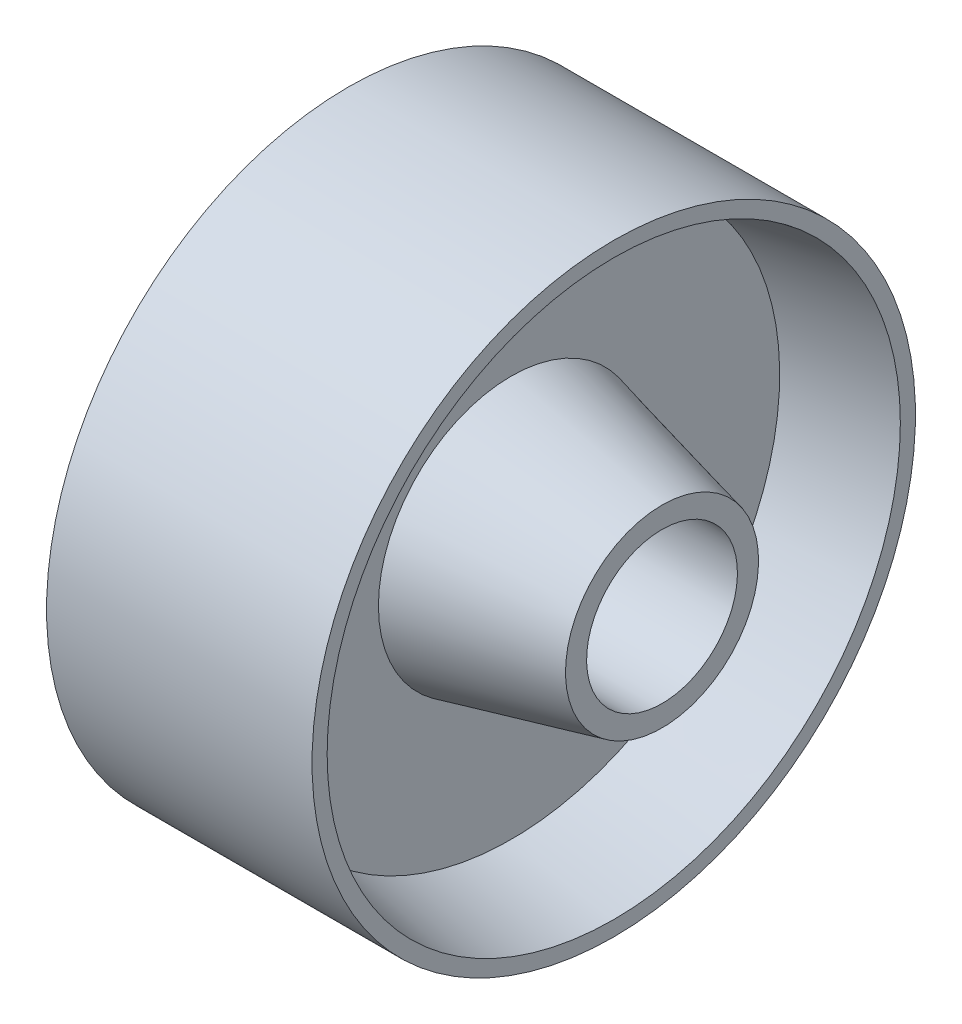
ISO-10303-21;
HEADER;
FILE_DESCRIPTION(('STEP AP214'),'2;1');
FILE_NAME('part.step','',(''),(''),'','','');
FILE_SCHEMA(('AUTOMOTIVE_DESIGN { 1 0 10303 214 1 1 1 1 }'));
ENDSEC;
DATA;
#1=APPLICATION_CONTEXT('core data for automotive mechanical design processes');
#2=APPLICATION_PROTOCOL_DEFINITION('international standard','automotive_design',2000,#1);
#3=PRODUCT_CONTEXT('',#1,'mechanical');
#4=PRODUCT('Part','Part','',(#3));
#5=PRODUCT_RELATED_PRODUCT_CATEGORY('part','',(#4));
#6=PRODUCT_DEFINITION_FORMATION('','',#4);
#7=PRODUCT_DEFINITION_CONTEXT('part definition',#1,'design');
#8=PRODUCT_DEFINITION('design','',#6,#7);
#9=PRODUCT_DEFINITION_SHAPE('','',#8);
#10=(LENGTH_UNIT() NAMED_UNIT(*) SI_UNIT(.MILLI.,.METRE.));
#11=(NAMED_UNIT(*) PLANE_ANGLE_UNIT() SI_UNIT($,.RADIAN.));
#12=(NAMED_UNIT(*) SI_UNIT($,.STERADIAN.) SOLID_ANGLE_UNIT());
#13=UNCERTAINTY_MEASURE_WITH_UNIT(LENGTH_MEASURE(1.E-05),#10,'distance_accuracy_value','');
#14=(GEOMETRIC_REPRESENTATION_CONTEXT(3) GLOBAL_UNCERTAINTY_ASSIGNED_CONTEXT((#13)) GLOBAL_UNIT_ASSIGNED_CONTEXT((#10,
#11,#12)) REPRESENTATION_CONTEXT('',''));
#15=CARTESIAN_POINT('',(0.,0.,0.));
#16=DIRECTION('',(0.,0.,1.));
#17=DIRECTION('',(1.,0.,0.));
#18=AXIS2_PLACEMENT_3D('',#15,#16,#17);
#19=CARTESIAN_POINT('',(-22.,-34.8636363636364,0.));
#20=DIRECTION('',(-1.,0.,0.));
#21=DIRECTION('',(0.,-1.,0.));
#22=AXIS2_PLACEMENT_3D('',#19,#20,#21);
#23=CONICAL_SURFACE('',#22,47.5,0.17467219900824);
#24=CARTESIAN_POINT('',(-4.99999999999999,-34.8636363636364,0.));
#25=DIRECTION('',(1.,0.,0.));
#26=DIRECTION('',(0.,1.,0.));
#27=AXIS2_PLACEMENT_3D('',#24,#25,#26);
#28=CIRCLE('',#27,44.5);
#29=CARTESIAN_POINT('',(-5.,9.63636363636364,0.));
#30=VERTEX_POINT('',#29);
#31=EDGE_CURVE('E84',#30,#30,#28,.T.);
#32=ORIENTED_EDGE('',*,*,#31,.T.);
#33=EDGE_LOOP('',(#32));
#34=FACE_BOUND('',#33,.T.);
#35=CARTESIAN_POINT('',(-22.,-34.8636363636364,0.));
#36=DIRECTION('',(1.,0.,0.));
#37=DIRECTION('',(0.,1.,0.));
#38=AXIS2_PLACEMENT_3D('',#35,#36,#37);
#39=CIRCLE('',#38,47.5);
#40=CARTESIAN_POINT('',(-22.,12.6363636363636,0.));
#41=VERTEX_POINT('',#40);
#42=EDGE_CURVE('E12',#41,#41,#39,.T.);
#43=ORIENTED_EDGE('',*,*,#42,.F.);
#44=EDGE_LOOP('',(#43));
#45=FACE_BOUND('',#44,.T.);
#46=ADVANCED_FACE('F44',(#34,#45),#23,.F.);
#47=CARTESIAN_POINT('',(-22.,12.6363636363636,0.));
#48=DIRECTION('',(-1.,0.,0.));
#49=DIRECTION('',(0.,-1.,0.));
#50=AXIS2_PLACEMENT_3D('',#47,#48,#49);
#51=PLANE('',#50);
#52=ORIENTED_EDGE('',*,*,#42,.T.);
#53=EDGE_LOOP('',(#52));
#54=FACE_BOUND('',#53,.T.);
#55=CARTESIAN_POINT('',(-22.,-34.8636363636364,0.));
#56=DIRECTION('',(1.,0.,0.));
#57=DIRECTION('',(0.,1.,0.));
#58=AXIS2_PLACEMENT_3D('',#55,#56,#57);
#59=CIRCLE('',#58,50.);
#60=CARTESIAN_POINT('',(-22.,15.1363636363636,0.));
#61=VERTEX_POINT('',#60);
#62=EDGE_CURVE('E50',#61,#61,#59,.T.);
#63=ORIENTED_EDGE('',*,*,#62,.F.);
#64=EDGE_LOOP('',(#63));
#65=FACE_BOUND('',#64,.T.);
#66=ADVANCED_FACE('F102',(#54,#65),#51,.T.);
#67=CARTESIAN_POINT('',(0.,-34.8636363636364,0.));
#68=DIRECTION('',(1.,0.,0.));
#69=DIRECTION('',(0.,1.,0.));
#70=AXIS2_PLACEMENT_3D('',#67,#68,#69);
#71=CYLINDRICAL_SURFACE('',#70,50.);
#72=ORIENTED_EDGE('',*,*,#62,.T.);
#73=EDGE_LOOP('',(#72));
#74=FACE_BOUND('',#73,.T.);
#75=CARTESIAN_POINT('',(22.,-34.8636363636364,0.));
#76=DIRECTION('',(1.,0.,0.));
#77=DIRECTION('',(0.,1.,0.));
#78=AXIS2_PLACEMENT_3D('',#75,#76,#77);
#79=CIRCLE('',#78,50.);
#80=CARTESIAN_POINT('',(22.,15.1363636363636,0.));
#81=VERTEX_POINT('',#80);
#82=EDGE_CURVE('E54',#81,#81,#79,.T.);
#83=ORIENTED_EDGE('',*,*,#82,.F.);
#84=EDGE_LOOP('',(#83));
#85=FACE_BOUND('',#84,.T.);
#86=ADVANCED_FACE('F106',(#74,#85),#71,.T.);
#87=CARTESIAN_POINT('',(22.,12.6363636363636,0.));
#88=DIRECTION('',(1.,0.,0.));
#89=DIRECTION('',(0.,1.,0.));
#90=AXIS2_PLACEMENT_3D('',#87,#88,#89);
#91=PLANE('',#90);
#92=ORIENTED_EDGE('',*,*,#82,.T.);
#93=EDGE_LOOP('',(#92));
#94=FACE_BOUND('',#93,.T.);
#95=CARTESIAN_POINT('',(22.,-34.8636363636364,0.));
#96=DIRECTION('',(1.,0.,0.));
#97=DIRECTION('',(0.,1.,0.));
#98=AXIS2_PLACEMENT_3D('',#95,#96,#97);
#99=CIRCLE('',#98,47.5);
#100=CARTESIAN_POINT('',(22.,12.6363636363636,0.));
#101=VERTEX_POINT('',#100);
#102=EDGE_CURVE('E58',#101,#101,#99,.T.);
#103=ORIENTED_EDGE('',*,*,#102,.F.);
#104=EDGE_LOOP('',(#103));
#105=FACE_BOUND('',#104,.T.);
#106=ADVANCED_FACE('F110',(#94,#105),#91,.T.);
#107=CARTESIAN_POINT('',(5.,-34.8636363636364,0.));
#108=DIRECTION('',(1.,0.,0.));
#109=DIRECTION('',(0.,1.,0.));
#110=AXIS2_PLACEMENT_3D('',#107,#108,#109);
#111=CONICAL_SURFACE('',#110,44.5,0.17467219900824);
#112=ORIENTED_EDGE('',*,*,#102,.T.);
#113=EDGE_LOOP('',(#112));
#114=FACE_BOUND('',#113,.T.);
#115=CARTESIAN_POINT('',(5.,-34.8636363636364,0.));
#116=DIRECTION('',(1.,0.,0.));
#117=DIRECTION('',(0.,1.,0.));
#118=AXIS2_PLACEMENT_3D('',#115,#116,#117);
#119=CIRCLE('',#118,44.5);
#120=CARTESIAN_POINT('',(5.,9.63636363636364,0.));
#121=VERTEX_POINT('',#120);
#122=EDGE_CURVE('E63',#121,#121,#119,.T.);
#123=ORIENTED_EDGE('',*,*,#122,.F.);
#124=EDGE_LOOP('',(#123));
#125=FACE_BOUND('',#124,.T.);
#126=ADVANCED_FACE('F116',(#114,#125),#111,.F.);
#127=CARTESIAN_POINT('',(5.,9.63636363636364,0.));
#128=DIRECTION('',(1.,0.,0.));
#129=DIRECTION('',(0.,1.,0.));
#130=AXIS2_PLACEMENT_3D('',#127,#128,#129);
#131=PLANE('',#130);
#132=ORIENTED_EDGE('',*,*,#122,.T.);
#133=EDGE_LOOP('',(#132));
#134=FACE_BOUND('',#133,.T.);
#135=CARTESIAN_POINT('',(5.,-34.8636363636364,0.));
#136=DIRECTION('',(1.,0.,0.));
#137=DIRECTION('',(0.,1.,0.));
#138=AXIS2_PLACEMENT_3D('',#135,#136,#137);
#139=CIRCLE('',#138,22.);
#140=CARTESIAN_POINT('',(4.99999999999999,-12.8636363636364,0.));
#141=VERTEX_POINT('',#140);
#142=EDGE_CURVE('E66',#141,#141,#139,.T.);
#143=ORIENTED_EDGE('',*,*,#142,.F.);
#144=EDGE_LOOP('',(#143));
#145=FACE_BOUND('',#144,.T.);
#146=ADVANCED_FACE('F120',(#134,#145),#131,.T.);
#147=CARTESIAN_POINT('',(30.,-34.8636363636363,0.));
#148=DIRECTION('',(-1.,0.,0.));
#149=DIRECTION('',(0.,-1.,0.));
#150=AXIS2_PLACEMENT_3D('',#147,#148,#149);
#151=CONICAL_SURFACE('',#150,16.,0.235544980720864);
#152=ORIENTED_EDGE('',*,*,#142,.T.);
#153=EDGE_LOOP('',(#152));
#154=FACE_BOUND('',#153,.T.);
#155=CARTESIAN_POINT('',(30.,-34.8636363636363,0.));
#156=DIRECTION('',(1.,0.,0.));
#157=DIRECTION('',(0.,1.,0.));
#158=AXIS2_PLACEMENT_3D('',#155,#156,#157);
#159=CIRCLE('',#158,16.);
#160=CARTESIAN_POINT('',(30.,-18.8636363636364,0.));
#161=VERTEX_POINT('',#160);
#162=EDGE_CURVE('E69',#161,#161,#159,.T.);
#163=ORIENTED_EDGE('',*,*,#162,.F.);
#164=EDGE_LOOP('',(#163));
#165=FACE_BOUND('',#164,.T.);
#166=ADVANCED_FACE('F124',(#154,#165),#151,.T.);
#167=CARTESIAN_POINT('',(30.,-18.8636363636364,0.));
#168=DIRECTION('',(1.,0.,0.));
#169=DIRECTION('',(0.,1.,0.));
#170=AXIS2_PLACEMENT_3D('',#167,#168,#169);
#171=PLANE('',#170);
#172=ORIENTED_EDGE('',*,*,#162,.T.);
#173=EDGE_LOOP('',(#172));
#174=FACE_BOUND('',#173,.T.);
#175=CARTESIAN_POINT('',(30.,-34.8636363636363,0.));
#176=DIRECTION('',(1.,0.,0.));
#177=DIRECTION('',(0.,1.,0.));
#178=AXIS2_PLACEMENT_3D('',#175,#176,#177);
#179=CIRCLE('',#178,12.5);
#180=CARTESIAN_POINT('',(30.,-22.3636363636364,0.));
#181=VERTEX_POINT('',#180);
#182=EDGE_CURVE('E72',#181,#181,#179,.T.);
#183=ORIENTED_EDGE('',*,*,#182,.F.);
#184=EDGE_LOOP('',(#183));
#185=FACE_BOUND('',#184,.T.);
#186=ADVANCED_FACE('F128',(#174,#185),#171,.T.);
#187=CARTESIAN_POINT('',(0.,-34.8636363636364,0.));
#188=DIRECTION('',(1.,0.,0.));
#189=DIRECTION('',(0.,1.,0.));
#190=AXIS2_PLACEMENT_3D('',#187,#188,#189);
#191=CYLINDRICAL_SURFACE('',#190,12.5);
#192=ORIENTED_EDGE('',*,*,#182,.T.);
#193=EDGE_LOOP('',(#192));
#194=FACE_BOUND('',#193,.T.);
#195=CARTESIAN_POINT('',(-30.,-34.8636363636364,0.));
#196=DIRECTION('',(1.,0.,0.));
#197=DIRECTION('',(0.,1.,0.));
#198=AXIS2_PLACEMENT_3D('',#195,#196,#197);
#199=CIRCLE('',#198,12.5);
#200=CARTESIAN_POINT('',(-30.,-22.3636363636364,0.));
#201=VERTEX_POINT('',#200);
#202=EDGE_CURVE('E75',#201,#201,#199,.T.);
#203=ORIENTED_EDGE('',*,*,#202,.F.);
#204=EDGE_LOOP('',(#203));
#205=FACE_BOUND('',#204,.T.);
#206=ADVANCED_FACE('F132',(#194,#205),#191,.F.);
#207=CARTESIAN_POINT('',(-30.,-18.8636363636364,0.));
#208=DIRECTION('',(-1.,0.,0.));
#209=DIRECTION('',(0.,-1.,0.));
#210=AXIS2_PLACEMENT_3D('',#207,#208,#209);
#211=PLANE('',#210);
#212=ORIENTED_EDGE('',*,*,#202,.T.);
#213=EDGE_LOOP('',(#212));
#214=FACE_BOUND('',#213,.T.);
#215=CARTESIAN_POINT('',(-30.,-34.8636363636364,0.));
#216=DIRECTION('',(1.,0.,0.));
#217=DIRECTION('',(0.,1.,0.));
#218=AXIS2_PLACEMENT_3D('',#215,#216,#217);
#219=CIRCLE('',#218,16.);
#220=CARTESIAN_POINT('',(-30.,-18.8636363636364,0.));
#221=VERTEX_POINT('',#220);
#222=EDGE_CURVE('E78',#221,#221,#219,.T.);
#223=ORIENTED_EDGE('',*,*,#222,.F.);
#224=EDGE_LOOP('',(#223));
#225=FACE_BOUND('',#224,.T.);
#226=ADVANCED_FACE('F98',(#214,#225),#211,.T.);
#227=CARTESIAN_POINT('',(-4.99999999999999,-34.8636363636364,0.));
#228=DIRECTION('',(1.,0.,0.));
#229=DIRECTION('',(0.,1.,0.));
#230=AXIS2_PLACEMENT_3D('',#227,#228,#229);
#231=CONICAL_SURFACE('',#230,22.,0.235544980720863);
#232=ORIENTED_EDGE('',*,*,#222,.T.);
#233=EDGE_LOOP('',(#232));
#234=FACE_BOUND('',#233,.T.);
#235=CARTESIAN_POINT('',(-4.99999999999999,-34.8636363636364,0.));
#236=DIRECTION('',(1.,0.,0.));
#237=DIRECTION('',(0.,1.,0.));
#238=AXIS2_PLACEMENT_3D('',#235,#236,#237);
#239=CIRCLE('',#238,22.);
#240=CARTESIAN_POINT('',(-4.99999999999999,-12.8636363636364,0.));
#241=VERTEX_POINT('',#240);
#242=EDGE_CURVE('E81',#241,#241,#239,.T.);
#243=ORIENTED_EDGE('',*,*,#242,.F.);
#244=EDGE_LOOP('',(#243));
#245=FACE_BOUND('',#244,.T.);
#246=ADVANCED_FACE('F92',(#234,#245),#231,.T.);
#247=CARTESIAN_POINT('',(-5.,9.63636363636364,0.));
#248=DIRECTION('',(-1.,0.,0.));
#249=DIRECTION('',(0.,-1.,0.));
#250=AXIS2_PLACEMENT_3D('',#247,#248,#249);
#251=PLANE('',#250);
#252=ORIENTED_EDGE('',*,*,#242,.T.);
#253=EDGE_LOOP('',(#252));
#254=FACE_BOUND('',#253,.T.);
#255=ORIENTED_EDGE('',*,*,#31,.F.);
#256=EDGE_LOOP('',(#255));
#257=FACE_BOUND('',#256,.T.);
#258=ADVANCED_FACE('F90',(#254,#257),#251,.T.);
#259=CLOSED_SHELL('',(#46,#66,#86,#106,#126,#146,#166,#186,#206,#226,#246,#258));
#260=MANIFOLD_SOLID_BREP('B2',#259);
#261=ADVANCED_BREP_SHAPE_REPRESENTATION('',(#18,#260),#14);
#262=SHAPE_DEFINITION_REPRESENTATION(#9,#261);
ENDSEC;
END-ISO-10303-21;
